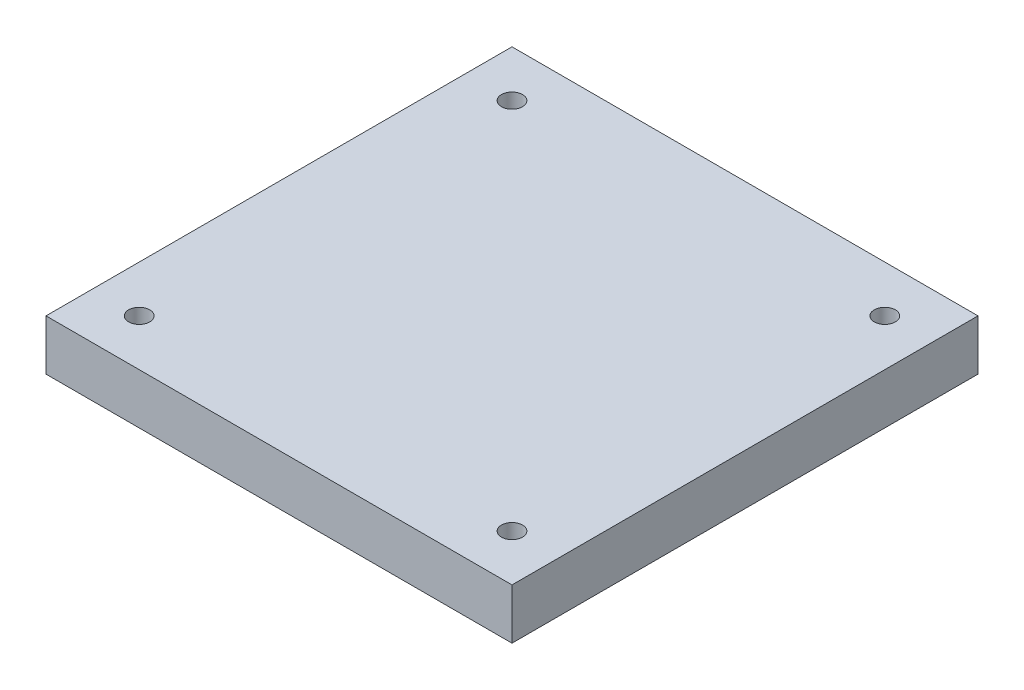
ISO-10303-21;
HEADER;
FILE_DESCRIPTION(('STEP AP214'),'2;1');
FILE_NAME('part.step','',(''),(''),'','','');
FILE_SCHEMA(('AUTOMOTIVE_DESIGN { 1 0 10303 214 1 1 1 1 }'));
ENDSEC;
DATA;
#1=APPLICATION_CONTEXT('core data for automotive mechanical design processes');
#2=APPLICATION_PROTOCOL_DEFINITION('international standard','automotive_design',2000,#1);
#3=PRODUCT_CONTEXT('',#1,'mechanical');
#4=PRODUCT('Part','Part','',(#3));
#5=PRODUCT_RELATED_PRODUCT_CATEGORY('part','',(#4));
#6=PRODUCT_DEFINITION_FORMATION('','',#4);
#7=PRODUCT_DEFINITION_CONTEXT('part definition',#1,'design');
#8=PRODUCT_DEFINITION('design','',#6,#7);
#9=PRODUCT_DEFINITION_SHAPE('','',#8);
#10=(LENGTH_UNIT() NAMED_UNIT(*) SI_UNIT(.MILLI.,.METRE.));
#11=(NAMED_UNIT(*) PLANE_ANGLE_UNIT() SI_UNIT($,.RADIAN.));
#12=(NAMED_UNIT(*) SI_UNIT($,.STERADIAN.) SOLID_ANGLE_UNIT());
#13=UNCERTAINTY_MEASURE_WITH_UNIT(LENGTH_MEASURE(1.E-05),#10,'distance_accuracy_value','');
#14=(GEOMETRIC_REPRESENTATION_CONTEXT(3) GLOBAL_UNCERTAINTY_ASSIGNED_CONTEXT((#13)) GLOBAL_UNIT_ASSIGNED_CONTEXT((#10,
#11,#12)) REPRESENTATION_CONTEXT('',''));
#15=CARTESIAN_POINT('',(0.,0.,0.));
#16=DIRECTION('',(0.,0.,1.));
#17=DIRECTION('',(1.,0.,0.));
#18=AXIS2_PLACEMENT_3D('',#15,#16,#17);
#19=CARTESIAN_POINT('',(0.,5.159375,0.));
#20=DIRECTION('',(0.,1.,0.));
#21=DIRECTION('',(0.,0.,1.));
#22=AXIS2_PLACEMENT_3D('',#19,#20,#21);
#23=PLANE('',#22);
#24=CARTESIAN_POINT('',(-38.1,5.159375,-38.1));
#25=DIRECTION('',(0.,-1.,0.));
#26=DIRECTION('',(0.,0.,-1.));
#27=AXIS2_PLACEMENT_3D('',#24,#25,#26);
#28=CIRCLE('',#27,2.15265);
#29=CARTESIAN_POINT('',(-38.1,5.159375,-40.25265));
#30=VERTEX_POINT('',#29);
#31=EDGE_CURVE('E193',#30,#30,#28,.T.);
#32=ORIENTED_EDGE('',*,*,#31,.T.);
#33=EDGE_LOOP('',(#32));
#34=FACE_BOUND('',#33,.T.);
#35=CARTESIAN_POINT('',(38.1,5.159375,38.1));
#36=DIRECTION('',(0.,-1.,0.));
#37=DIRECTION('',(0.,0.,-1.));
#38=AXIS2_PLACEMENT_3D('',#35,#36,#37);
#39=CIRCLE('',#38,2.15265);
#40=CARTESIAN_POINT('',(38.1,5.159375,35.94735));
#41=VERTEX_POINT('',#40);
#42=EDGE_CURVE('E179',#41,#41,#39,.T.);
#43=ORIENTED_EDGE('',*,*,#42,.T.);
#44=EDGE_LOOP('',(#43));
#45=FACE_BOUND('',#44,.T.);
#46=CARTESIAN_POINT('',(38.1,5.159375,-38.1));
#47=DIRECTION('',(0.,-1.,0.));
#48=DIRECTION('',(0.,0.,-1.));
#49=AXIS2_PLACEMENT_3D('',#46,#47,#48);
#50=CIRCLE('',#49,2.15265);
#51=CARTESIAN_POINT('',(38.1,5.159375,-40.25265));
#52=VERTEX_POINT('',#51);
#53=EDGE_CURVE('E162',#52,#52,#50,.T.);
#54=ORIENTED_EDGE('',*,*,#53,.T.);
#55=EDGE_LOOP('',(#54));
#56=FACE_BOUND('',#55,.T.);
#57=CARTESIAN_POINT('',(-38.1,5.159375,38.1));
#58=DIRECTION('',(0.,-1.,0.));
#59=DIRECTION('',(0.,0.,-1.));
#60=AXIS2_PLACEMENT_3D('',#57,#58,#59);
#61=CIRCLE('',#60,2.15265);
#62=CARTESIAN_POINT('',(-38.1,5.159375,35.94735));
#63=VERTEX_POINT('',#62);
#64=EDGE_CURVE('E119',#63,#63,#61,.T.);
#65=ORIENTED_EDGE('',*,*,#64,.T.);
#66=EDGE_LOOP('',(#65));
#67=FACE_BOUND('',#66,.T.);
#68=DIRECTION('',(1.,0.,0.));
#69=VECTOR('',#68,1.);
#70=CARTESIAN_POINT('',(-47.625,5.159375,47.625));
#71=LINE('',#70,#69);
#72=CARTESIAN_POINT('',(-47.625,5.159375,47.625));
#73=VERTEX_POINT('',#72);
#74=CARTESIAN_POINT('',(47.625,5.159375,47.625));
#75=VERTEX_POINT('',#74);
#76=EDGE_CURVE('E95',#73,#75,#71,.T.);
#77=ORIENTED_EDGE('',*,*,#76,.T.);
#78=DIRECTION('',(0.,0.,-1.));
#79=VECTOR('',#78,1.);
#80=CARTESIAN_POINT('',(47.625,5.159375,47.625));
#81=LINE('',#80,#79);
#82=CARTESIAN_POINT('',(47.625,5.159375,-47.625));
#83=VERTEX_POINT('',#82);
#84=EDGE_CURVE('E114',#75,#83,#81,.T.);
#85=ORIENTED_EDGE('',*,*,#84,.T.);
#86=DIRECTION('',(-1.,0.,0.));
#87=VECTOR('',#86,1.);
#88=CARTESIAN_POINT('',(-47.625,5.159375,-47.625));
#89=LINE('',#88,#87);
#90=CARTESIAN_POINT('',(-47.625,5.159375,-47.625));
#91=VERTEX_POINT('',#90);
#92=EDGE_CURVE('E118',#83,#91,#89,.T.);
#93=ORIENTED_EDGE('',*,*,#92,.T.);
#94=DIRECTION('',(0.,0.,1.));
#95=VECTOR('',#94,1.);
#96=CARTESIAN_POINT('',(-47.625,5.159375,47.625));
#97=LINE('',#96,#95);
#98=EDGE_CURVE('E73',#91,#73,#97,.T.);
#99=ORIENTED_EDGE('',*,*,#98,.T.);
#100=EDGE_LOOP('',(#77,#85,#93,#99));
#101=FACE_BOUND('',#100,.T.);
#102=ADVANCED_FACE('F48',(#34,#45,#56,#67,#101),#23,.T.);
#103=CARTESIAN_POINT('',(47.625,-5.159375,47.625));
#104=DIRECTION('',(1.,0.,0.));
#105=DIRECTION('',(0.,0.,-1.));
#106=AXIS2_PLACEMENT_3D('',#103,#104,#105);
#107=PLANE('',#106);
#108=ORIENTED_EDGE('',*,*,#84,.F.);
#109=DIRECTION('',(0.,1.,0.));
#110=VECTOR('',#109,1.);
#111=CARTESIAN_POINT('',(47.625,-5.159375,47.625));
#112=LINE('',#111,#110);
#113=CARTESIAN_POINT('',(47.625,-5.159375,47.625));
#114=VERTEX_POINT('',#113);
#115=EDGE_CURVE('E12',#114,#75,#112,.T.);
#116=ORIENTED_EDGE('',*,*,#115,.F.);
#117=DIRECTION('',(0.,0.,-1.));
#118=VECTOR('',#117,1.);
#119=CARTESIAN_POINT('',(47.625,-5.159375,47.625));
#120=LINE('',#119,#118);
#121=CARTESIAN_POINT('',(47.625,-5.159375,-47.625));
#122=VERTEX_POINT('',#121);
#123=EDGE_CURVE('E65',#114,#122,#120,.T.);
#124=ORIENTED_EDGE('',*,*,#123,.T.);
#125=DIRECTION('',(0.,1.,0.));
#126=VECTOR('',#125,1.);
#127=CARTESIAN_POINT('',(47.625,-5.159375,-47.625));
#128=LINE('',#127,#126);
#129=EDGE_CURVE('E51',#122,#83,#128,.T.);
#130=ORIENTED_EDGE('',*,*,#129,.T.);
#131=EDGE_LOOP('',(#108,#116,#124,#130));
#132=FACE_BOUND('',#131,.T.);
#133=ADVANCED_FACE('F132',(#132),#107,.T.);
#134=CARTESIAN_POINT('',(-47.625,-5.159375,47.625));
#135=DIRECTION('',(0.,0.,1.));
#136=DIRECTION('',(1.,0.,0.));
#137=AXIS2_PLACEMENT_3D('',#134,#135,#136);
#138=PLANE('',#137);
#139=ORIENTED_EDGE('',*,*,#76,.F.);
#140=DIRECTION('',(0.,1.,0.));
#141=VECTOR('',#140,1.);
#142=CARTESIAN_POINT('',(-47.625,-5.159375,47.625));
#143=LINE('',#142,#141);
#144=CARTESIAN_POINT('',(-47.625,-5.159375,47.625));
#145=VERTEX_POINT('',#144);
#146=EDGE_CURVE('E57',#145,#73,#143,.T.);
#147=ORIENTED_EDGE('',*,*,#146,.F.);
#148=DIRECTION('',(1.,0.,0.));
#149=VECTOR('',#148,1.);
#150=CARTESIAN_POINT('',(-47.625,-5.159375,47.625));
#151=LINE('',#150,#149);
#152=EDGE_CURVE('E93',#145,#114,#151,.T.);
#153=ORIENTED_EDGE('',*,*,#152,.T.);
#154=ORIENTED_EDGE('',*,*,#115,.T.);
#155=EDGE_LOOP('',(#139,#147,#153,#154));
#156=FACE_BOUND('',#155,.T.);
#157=ADVANCED_FACE('F91',(#156),#138,.T.);
#158=CARTESIAN_POINT('',(-47.625,-5.159375,47.625));
#159=DIRECTION('',(-1.,0.,0.));
#160=DIRECTION('',(0.,0.,1.));
#161=AXIS2_PLACEMENT_3D('',#158,#159,#160);
#162=PLANE('',#161);
#163=ORIENTED_EDGE('',*,*,#98,.F.);
#164=DIRECTION('',(0.,1.,0.));
#165=VECTOR('',#164,1.);
#166=CARTESIAN_POINT('',(-47.625,-5.159375,-47.625));
#167=LINE('',#166,#165);
#168=CARTESIAN_POINT('',(-47.625,-5.159375,-47.625));
#169=VERTEX_POINT('',#168);
#170=EDGE_CURVE('E97',#169,#91,#167,.T.);
#171=ORIENTED_EDGE('',*,*,#170,.F.);
#172=DIRECTION('',(0.,0.,1.));
#173=VECTOR('',#172,1.);
#174=CARTESIAN_POINT('',(-47.625,-5.159375,47.625));
#175=LINE('',#174,#173);
#176=EDGE_CURVE('E100',#169,#145,#175,.T.);
#177=ORIENTED_EDGE('',*,*,#176,.T.);
#178=ORIENTED_EDGE('',*,*,#146,.T.);
#179=EDGE_LOOP('',(#163,#171,#177,#178));
#180=FACE_BOUND('',#179,.T.);
#181=ADVANCED_FACE('F101',(#180),#162,.T.);
#182=CARTESIAN_POINT('',(-47.625,-5.159375,-47.625));
#183=DIRECTION('',(0.,0.,-1.));
#184=DIRECTION('',(-1.,0.,0.));
#185=AXIS2_PLACEMENT_3D('',#182,#183,#184);
#186=PLANE('',#185);
#187=ORIENTED_EDGE('',*,*,#92,.F.);
#188=ORIENTED_EDGE('',*,*,#129,.F.);
#189=DIRECTION('',(-1.,0.,0.));
#190=VECTOR('',#189,1.);
#191=CARTESIAN_POINT('',(-47.625,-5.159375,-47.625));
#192=LINE('',#191,#190);
#193=EDGE_CURVE('E106',#122,#169,#192,.T.);
#194=ORIENTED_EDGE('',*,*,#193,.T.);
#195=ORIENTED_EDGE('',*,*,#170,.T.);
#196=EDGE_LOOP('',(#187,#188,#194,#195));
#197=FACE_BOUND('',#196,.T.);
#198=ADVANCED_FACE('F129',(#197),#186,.T.);
#199=CARTESIAN_POINT('',(0.,-5.159375,0.));
#200=DIRECTION('',(0.,-1.,0.));
#201=DIRECTION('',(0.,0.,-1.));
#202=AXIS2_PLACEMENT_3D('',#199,#200,#201);
#203=PLANE('',#202);
#204=CARTESIAN_POINT('',(-38.1,-5.159375,-38.1));
#205=DIRECTION('',(0.,-1.,0.));
#206=DIRECTION('',(0.,0.,-1.));
#207=AXIS2_PLACEMENT_3D('',#204,#205,#206);
#208=CIRCLE('',#207,3.96875);
#209=CARTESIAN_POINT('',(-38.1,-5.159375,-42.06875));
#210=VERTEX_POINT('',#209);
#211=EDGE_CURVE('E174',#210,#210,#208,.T.);
#212=ORIENTED_EDGE('',*,*,#211,.F.);
#213=EDGE_LOOP('',(#212));
#214=FACE_BOUND('',#213,.T.);
#215=CARTESIAN_POINT('',(38.1,-5.159375,38.1));
#216=DIRECTION('',(0.,-1.,0.));
#217=DIRECTION('',(0.,0.,-1.));
#218=AXIS2_PLACEMENT_3D('',#215,#216,#217);
#219=CIRCLE('',#218,3.96875);
#220=CARTESIAN_POINT('',(38.1,-5.159375,34.13125));
#221=VERTEX_POINT('',#220);
#222=EDGE_CURVE('E157',#221,#221,#219,.T.);
#223=ORIENTED_EDGE('',*,*,#222,.F.);
#224=EDGE_LOOP('',(#223));
#225=FACE_BOUND('',#224,.T.);
#226=CARTESIAN_POINT('',(38.1,-5.159375,-38.1));
#227=DIRECTION('',(0.,-1.,0.));
#228=DIRECTION('',(0.,0.,-1.));
#229=AXIS2_PLACEMENT_3D('',#226,#227,#228);
#230=CIRCLE('',#229,3.96875);
#231=CARTESIAN_POINT('',(38.1,-5.159375,-42.06875));
#232=VERTEX_POINT('',#231);
#233=EDGE_CURVE('E166',#232,#232,#230,.T.);
#234=ORIENTED_EDGE('',*,*,#233,.F.);
#235=EDGE_LOOP('',(#234));
#236=FACE_BOUND('',#235,.T.);
#237=CARTESIAN_POINT('',(-38.1,-5.159375,38.1));
#238=DIRECTION('',(0.,-1.,0.));
#239=DIRECTION('',(0.,0.,-1.));
#240=AXIS2_PLACEMENT_3D('',#237,#238,#239);
#241=CIRCLE('',#240,3.96875);
#242=CARTESIAN_POINT('',(-38.1,-5.159375,34.13125));
#243=VERTEX_POINT('',#242);
#244=EDGE_CURVE('E148',#243,#243,#241,.T.);
#245=ORIENTED_EDGE('',*,*,#244,.F.);
#246=EDGE_LOOP('',(#245));
#247=FACE_BOUND('',#246,.T.);
#248=ORIENTED_EDGE('',*,*,#193,.F.);
#249=ORIENTED_EDGE('',*,*,#123,.F.);
#250=ORIENTED_EDGE('',*,*,#152,.F.);
#251=ORIENTED_EDGE('',*,*,#176,.F.);
#252=EDGE_LOOP('',(#248,#249,#250,#251));
#253=FACE_BOUND('',#252,.T.);
#254=ADVANCED_FACE('F108',(#214,#225,#236,#247,#253),#203,.T.);
#255=CARTESIAN_POINT('',(-38.1,-5.159375,38.1));
#256=DIRECTION('',(0.,-1.,0.));
#257=DIRECTION('',(0.,0.,-1.));
#258=AXIS2_PLACEMENT_3D('',#255,#256,#257);
#259=CYLINDRICAL_SURFACE('',#258,2.15265);
#260=ORIENTED_EDGE('',*,*,#64,.F.);
#261=EDGE_LOOP('',(#260));
#262=FACE_BOUND('',#261,.T.);
#263=CARTESIAN_POINT('',(-38.1,0.225424999999999,38.1));
#264=DIRECTION('',(0.,-1.,0.));
#265=DIRECTION('',(0.,0.,-1.));
#266=AXIS2_PLACEMENT_3D('',#263,#264,#265);
#267=CIRCLE('',#266,2.15265);
#268=CARTESIAN_POINT('',(-38.1,0.225424999999999,35.94735));
#269=VERTEX_POINT('',#268);
#270=EDGE_CURVE('E140',#269,#269,#267,.T.);
#271=ORIENTED_EDGE('',*,*,#270,.T.);
#272=EDGE_LOOP('',(#271));
#273=FACE_BOUND('',#272,.T.);
#274=ADVANCED_FACE('F205',(#262,#273),#259,.F.);
#275=CARTESIAN_POINT('',(-35.94735,0.225424999999999,38.1));
#276=DIRECTION('',(0.,1.,0.));
#277=DIRECTION('',(0.,0.,1.));
#278=AXIS2_PLACEMENT_3D('',#275,#276,#277);
#279=PLANE('',#278);
#280=ORIENTED_EDGE('',*,*,#270,.F.);
#281=EDGE_LOOP('',(#280));
#282=FACE_BOUND('',#281,.T.);
#283=CARTESIAN_POINT('',(-38.1,0.225424999999999,38.1));
#284=DIRECTION('',(0.,-1.,0.));
#285=DIRECTION('',(0.,0.,-1.));
#286=AXIS2_PLACEMENT_3D('',#283,#284,#285);
#287=CIRCLE('',#286,3.96875);
#288=CARTESIAN_POINT('',(-38.1,0.225424999999999,34.13125));
#289=VERTEX_POINT('',#288);
#290=EDGE_CURVE('E144',#289,#289,#287,.T.);
#291=ORIENTED_EDGE('',*,*,#290,.T.);
#292=EDGE_LOOP('',(#291));
#293=FACE_BOUND('',#292,.T.);
#294=ADVANCED_FACE('F215',(#282,#293),#279,.F.);
#295=CARTESIAN_POINT('',(-38.1,-5.159375,38.1));
#296=DIRECTION('',(0.,-1.,0.));
#297=DIRECTION('',(0.,0.,-1.));
#298=AXIS2_PLACEMENT_3D('',#295,#296,#297);
#299=CYLINDRICAL_SURFACE('',#298,3.96875);
#300=ORIENTED_EDGE('',*,*,#290,.F.);
#301=EDGE_LOOP('',(#300));
#302=FACE_BOUND('',#301,.T.);
#303=ORIENTED_EDGE('',*,*,#244,.T.);
#304=EDGE_LOOP('',(#303));
#305=FACE_BOUND('',#304,.T.);
#306=ADVANCED_FACE('F212',(#302,#305),#299,.F.);
#307=CARTESIAN_POINT('',(38.1,-5.159375,-38.1));
#308=DIRECTION('',(0.,-1.,0.));
#309=DIRECTION('',(0.,0.,-1.));
#310=AXIS2_PLACEMENT_3D('',#307,#308,#309);
#311=CYLINDRICAL_SURFACE('',#310,2.15265);
#312=ORIENTED_EDGE('',*,*,#53,.F.);
#313=EDGE_LOOP('',(#312));
#314=FACE_BOUND('',#313,.T.);
#315=CARTESIAN_POINT('',(38.1,0.225424999999999,-38.1));
#316=DIRECTION('',(0.,-1.,0.));
#317=DIRECTION('',(0.,0.,-1.));
#318=AXIS2_PLACEMENT_3D('',#315,#316,#317);
#319=CIRCLE('',#318,2.15265);
#320=CARTESIAN_POINT('',(38.1,0.225424999999999,-40.25265));
#321=VERTEX_POINT('',#320);
#322=EDGE_CURVE('E153',#321,#321,#319,.T.);
#323=ORIENTED_EDGE('',*,*,#322,.T.);
#324=EDGE_LOOP('',(#323));
#325=FACE_BOUND('',#324,.T.);
#326=ADVANCED_FACE('F214',(#314,#325),#311,.F.);
#327=CARTESIAN_POINT('',(40.25265,0.225424999999999,-38.1));
#328=DIRECTION('',(0.,1.,0.));
#329=DIRECTION('',(0.,0.,1.));
#330=AXIS2_PLACEMENT_3D('',#327,#328,#329);
#331=PLANE('',#330);
#332=ORIENTED_EDGE('',*,*,#322,.F.);
#333=EDGE_LOOP('',(#332));
#334=FACE_BOUND('',#333,.T.);
#335=CARTESIAN_POINT('',(38.1,0.225424999999999,-38.1));
#336=DIRECTION('',(0.,-1.,0.));
#337=DIRECTION('',(0.,0.,-1.));
#338=AXIS2_PLACEMENT_3D('',#335,#336,#337);
#339=CIRCLE('',#338,3.96875);
#340=CARTESIAN_POINT('',(38.1,0.225424999999999,-42.06875));
#341=VERTEX_POINT('',#340);
#342=EDGE_CURVE('E158',#341,#341,#339,.T.);
#343=ORIENTED_EDGE('',*,*,#342,.T.);
#344=EDGE_LOOP('',(#343));
#345=FACE_BOUND('',#344,.T.);
#346=ADVANCED_FACE('F222',(#334,#345),#331,.F.);
#347=CARTESIAN_POINT('',(38.1,-5.159375,-38.1));
#348=DIRECTION('',(0.,-1.,0.));
#349=DIRECTION('',(0.,0.,-1.));
#350=AXIS2_PLACEMENT_3D('',#347,#348,#349);
#351=CYLINDRICAL_SURFACE('',#350,3.96875);
#352=ORIENTED_EDGE('',*,*,#342,.F.);
#353=EDGE_LOOP('',(#352));
#354=FACE_BOUND('',#353,.T.);
#355=ORIENTED_EDGE('',*,*,#233,.T.);
#356=EDGE_LOOP('',(#355));
#357=FACE_BOUND('',#356,.T.);
#358=ADVANCED_FACE('F283',(#354,#357),#351,.F.);
#359=CARTESIAN_POINT('',(38.1,-5.159375,38.1));
#360=DIRECTION('',(0.,-1.,0.));
#361=DIRECTION('',(0.,0.,-1.));
#362=AXIS2_PLACEMENT_3D('',#359,#360,#361);
#363=CYLINDRICAL_SURFACE('',#362,2.15265);
#364=ORIENTED_EDGE('',*,*,#42,.F.);
#365=EDGE_LOOP('',(#364));
#366=FACE_BOUND('',#365,.T.);
#367=CARTESIAN_POINT('',(38.1,0.225424999999999,38.1));
#368=DIRECTION('',(0.,-1.,0.));
#369=DIRECTION('',(0.,0.,-1.));
#370=AXIS2_PLACEMENT_3D('',#367,#368,#369);
#371=CIRCLE('',#370,2.15265);
#372=CARTESIAN_POINT('',(38.1,0.225424999999999,35.94735));
#373=VERTEX_POINT('',#372);
#374=EDGE_CURVE('E170',#373,#373,#371,.T.);
#375=ORIENTED_EDGE('',*,*,#374,.T.);
#376=EDGE_LOOP('',(#375));
#377=FACE_BOUND('',#376,.T.);
#378=ADVANCED_FACE('F294',(#366,#377),#363,.F.);
#379=CARTESIAN_POINT('',(40.25265,0.225424999999999,38.1));
#380=DIRECTION('',(0.,1.,0.));
#381=DIRECTION('',(0.,0.,1.));
#382=AXIS2_PLACEMENT_3D('',#379,#380,#381);
#383=PLANE('',#382);
#384=ORIENTED_EDGE('',*,*,#374,.F.);
#385=EDGE_LOOP('',(#384));
#386=FACE_BOUND('',#385,.T.);
#387=CARTESIAN_POINT('',(38.1,0.225424999999999,38.1));
#388=DIRECTION('',(0.,-1.,0.));
#389=DIRECTION('',(0.,0.,-1.));
#390=AXIS2_PLACEMENT_3D('',#387,#388,#389);
#391=CIRCLE('',#390,3.96875);
#392=CARTESIAN_POINT('',(38.1,0.225424999999999,34.13125));
#393=VERTEX_POINT('',#392);
#394=EDGE_CURVE('E175',#393,#393,#391,.T.);
#395=ORIENTED_EDGE('',*,*,#394,.T.);
#396=EDGE_LOOP('',(#395));
#397=FACE_BOUND('',#396,.T.);
#398=ADVANCED_FACE('F305',(#386,#397),#383,.F.);
#399=CARTESIAN_POINT('',(38.1,-5.159375,38.1));
#400=DIRECTION('',(0.,-1.,0.));
#401=DIRECTION('',(0.,0.,-1.));
#402=AXIS2_PLACEMENT_3D('',#399,#400,#401);
#403=CYLINDRICAL_SURFACE('',#402,3.96875);
#404=ORIENTED_EDGE('',*,*,#394,.F.);
#405=EDGE_LOOP('',(#404));
#406=FACE_BOUND('',#405,.T.);
#407=ORIENTED_EDGE('',*,*,#222,.T.);
#408=EDGE_LOOP('',(#407));
#409=FACE_BOUND('',#408,.T.);
#410=ADVANCED_FACE('F316',(#406,#409),#403,.F.);
#411=CARTESIAN_POINT('',(-38.1,-5.159375,-38.1));
#412=DIRECTION('',(0.,-1.,0.));
#413=DIRECTION('',(0.,0.,-1.));
#414=AXIS2_PLACEMENT_3D('',#411,#412,#413);
#415=CYLINDRICAL_SURFACE('',#414,2.15265);
#416=ORIENTED_EDGE('',*,*,#31,.F.);
#417=EDGE_LOOP('',(#416));
#418=FACE_BOUND('',#417,.T.);
#419=CARTESIAN_POINT('',(-38.1,0.225424999999999,-38.1));
#420=DIRECTION('',(0.,-1.,0.));
#421=DIRECTION('',(0.,0.,-1.));
#422=AXIS2_PLACEMENT_3D('',#419,#420,#421);
#423=CIRCLE('',#422,2.15265);
#424=CARTESIAN_POINT('',(-38.1,0.225424999999999,-40.25265));
#425=VERTEX_POINT('',#424);
#426=EDGE_CURVE('E152',#425,#425,#423,.T.);
#427=ORIENTED_EDGE('',*,*,#426,.T.);
#428=EDGE_LOOP('',(#427));
#429=FACE_BOUND('',#428,.T.);
#430=ADVANCED_FACE('F327',(#418,#429),#415,.F.);
#431=CARTESIAN_POINT('',(-35.94735,0.225424999999999,-38.1));
#432=DIRECTION('',(0.,1.,0.));
#433=DIRECTION('',(0.,0.,1.));
#434=AXIS2_PLACEMENT_3D('',#431,#432,#433);
#435=PLANE('',#434);
#436=ORIENTED_EDGE('',*,*,#426,.F.);
#437=EDGE_LOOP('',(#436));
#438=FACE_BOUND('',#437,.T.);
#439=CARTESIAN_POINT('',(-38.1,0.225424999999999,-38.1));
#440=DIRECTION('',(0.,-1.,0.));
#441=DIRECTION('',(0.,0.,-1.));
#442=AXIS2_PLACEMENT_3D('',#439,#440,#441);
#443=CIRCLE('',#442,3.96875);
#444=CARTESIAN_POINT('',(-38.1,0.225424999999999,-42.06875));
#445=VERTEX_POINT('',#444);
#446=EDGE_CURVE('E189',#445,#445,#443,.T.);
#447=ORIENTED_EDGE('',*,*,#446,.T.);
#448=EDGE_LOOP('',(#447));
#449=FACE_BOUND('',#448,.T.);
#450=ADVANCED_FACE('F338',(#438,#449),#435,.F.);
#451=CARTESIAN_POINT('',(-38.1,-5.159375,-38.1));
#452=DIRECTION('',(0.,-1.,0.));
#453=DIRECTION('',(0.,0.,-1.));
#454=AXIS2_PLACEMENT_3D('',#451,#452,#453);
#455=CYLINDRICAL_SURFACE('',#454,3.96875);
#456=ORIENTED_EDGE('',*,*,#446,.F.);
#457=EDGE_LOOP('',(#456));
#458=FACE_BOUND('',#457,.T.);
#459=ORIENTED_EDGE('',*,*,#211,.T.);
#460=EDGE_LOOP('',(#459));
#461=FACE_BOUND('',#460,.T.);
#462=ADVANCED_FACE('F201',(#458,#461),#455,.F.);
#463=CLOSED_SHELL('',(#102,#133,#157,#181,#198,#254,#274,#294,#306,#326,#346,#358,#378,#398,
#410,#430,#450,#462));
#464=MANIFOLD_SOLID_BREP('B2',#463);
#465=ADVANCED_BREP_SHAPE_REPRESENTATION('',(#18,#464),#14);
#466=SHAPE_DEFINITION_REPRESENTATION(#9,#465);
ENDSEC;
END-ISO-10303-21;
